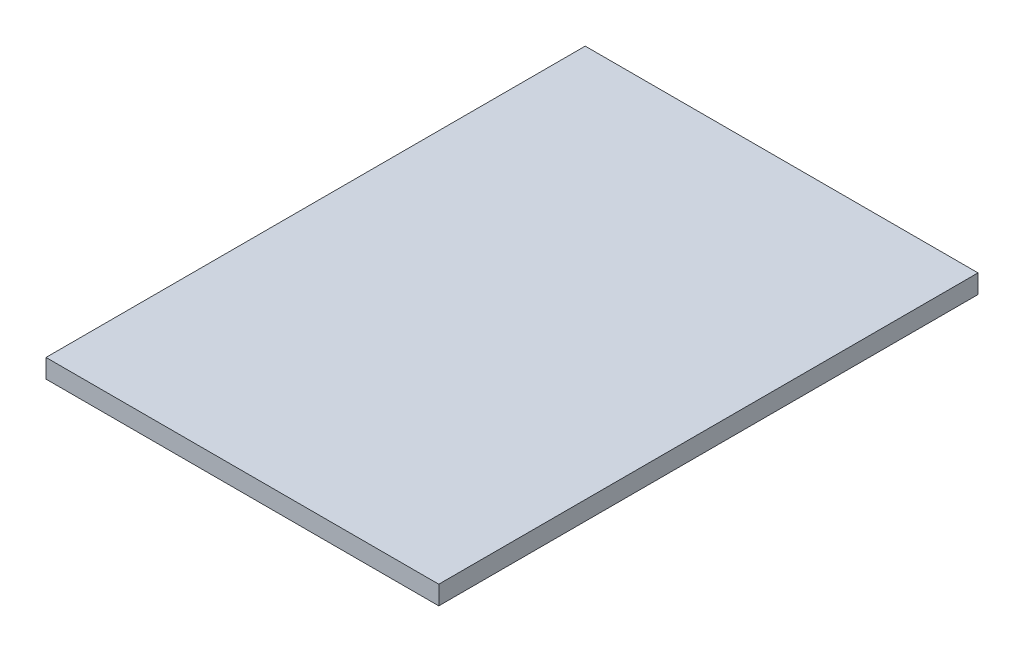
ISO-10303-21;
HEADER;
FILE_DESCRIPTION(('STEP AP214'),'2;1');
FILE_NAME('part.step','',(''),(''),'','','');
FILE_SCHEMA(('AUTOMOTIVE_DESIGN { 1 0 10303 214 1 1 1 1 }'));
ENDSEC;
DATA;
#1=APPLICATION_CONTEXT('core data for automotive mechanical design processes');
#2=APPLICATION_PROTOCOL_DEFINITION('international standard','automotive_design',2000,#1);
#3=PRODUCT_CONTEXT('',#1,'mechanical');
#4=PRODUCT('Part','Part','',(#3));
#5=PRODUCT_RELATED_PRODUCT_CATEGORY('part','',(#4));
#6=PRODUCT_DEFINITION_FORMATION('','',#4);
#7=PRODUCT_DEFINITION_CONTEXT('part definition',#1,'design');
#8=PRODUCT_DEFINITION('design','',#6,#7);
#9=PRODUCT_DEFINITION_SHAPE('','',#8);
#10=(LENGTH_UNIT() NAMED_UNIT(*) SI_UNIT(.MILLI.,.METRE.));
#11=(NAMED_UNIT(*) PLANE_ANGLE_UNIT() SI_UNIT($,.RADIAN.));
#12=(NAMED_UNIT(*) SI_UNIT($,.STERADIAN.) SOLID_ANGLE_UNIT());
#13=UNCERTAINTY_MEASURE_WITH_UNIT(LENGTH_MEASURE(1.E-05),#10,'distance_accuracy_value','');
#14=(GEOMETRIC_REPRESENTATION_CONTEXT(3) GLOBAL_UNCERTAINTY_ASSIGNED_CONTEXT((#13)) GLOBAL_UNIT_ASSIGNED_CONTEXT((#10,
#11,#12)) REPRESENTATION_CONTEXT('',''));
#15=CARTESIAN_POINT('',(0.,0.,0.));
#16=DIRECTION('',(0.,0.,1.));
#17=DIRECTION('',(1.,0.,0.));
#18=AXIS2_PLACEMENT_3D('',#15,#16,#17);
#19=CARTESIAN_POINT('',(66.3516113024572,6.35,91.0945548263358));
#20=DIRECTION('',(-1.,0.,0.));
#21=DIRECTION('',(0.,0.,1.));
#22=AXIS2_PLACEMENT_3D('',#19,#20,#21);
#23=PLANE('',#22);
#24=DIRECTION('',(0.,0.,-1.));
#25=VECTOR('',#24,1.);
#26=CARTESIAN_POINT('',(66.3516113024572,0.,91.0945548263358));
#27=LINE('',#26,#25);
#28=CARTESIAN_POINT('',(66.3516113024572,0.,91.0945548263358));
#29=VERTEX_POINT('',#28);
#30=CARTESIAN_POINT('',(66.3516113024572,0.,-91.0945548263358));
#31=VERTEX_POINT('',#30);
#32=EDGE_CURVE('E111',#29,#31,#27,.T.);
#33=ORIENTED_EDGE('',*,*,#32,.T.);
#34=DIRECTION('',(0.,-1.,0.));
#35=VECTOR('',#34,1.);
#36=CARTESIAN_POINT('',(66.3516113024572,6.35,-91.0945548263358));
#37=LINE('',#36,#35);
#38=CARTESIAN_POINT('',(66.3516113024572,6.35,-91.0945548263358));
#39=VERTEX_POINT('',#38);
#40=EDGE_CURVE('E11',#39,#31,#37,.T.);
#41=ORIENTED_EDGE('',*,*,#40,.F.);
#42=DIRECTION('',(0.,0.,-1.));
#43=VECTOR('',#42,1.);
#44=CARTESIAN_POINT('',(66.3516113024572,6.35,91.0945548263358));
#45=LINE('',#44,#43);
#46=CARTESIAN_POINT('',(66.3516113024572,6.35,91.0945548263358));
#47=VERTEX_POINT('',#46);
#48=EDGE_CURVE('E95',#47,#39,#45,.T.);
#49=ORIENTED_EDGE('',*,*,#48,.F.);
#50=DIRECTION('',(0.,-1.,0.));
#51=VECTOR('',#50,1.);
#52=CARTESIAN_POINT('',(66.3516113024572,6.35,91.0945548263358));
#53=LINE('',#52,#51);
#54=EDGE_CURVE('E107',#47,#29,#53,.T.);
#55=ORIENTED_EDGE('',*,*,#54,.T.);
#56=EDGE_LOOP('',(#33,#41,#49,#55));
#57=FACE_BOUND('',#56,.T.);
#58=ADVANCED_FACE('F43',(#57),#23,.F.);
#59=CARTESIAN_POINT('',(-66.3516113024572,6.35,-91.0945548263358));
#60=DIRECTION('',(0.,0.,1.));
#61=DIRECTION('',(1.,0.,0.));
#62=AXIS2_PLACEMENT_3D('',#59,#60,#61);
#63=PLANE('',#62);
#64=DIRECTION('',(-1.,0.,0.));
#65=VECTOR('',#64,1.);
#66=CARTESIAN_POINT('',(-66.3516113024572,0.,-91.0945548263358));
#67=LINE('',#66,#65);
#68=CARTESIAN_POINT('',(-66.3516113024572,0.,-91.0945548263358));
#69=VERTEX_POINT('',#68);
#70=EDGE_CURVE('E100',#31,#69,#67,.T.);
#71=ORIENTED_EDGE('',*,*,#70,.T.);
#72=DIRECTION('',(0.,-1.,0.));
#73=VECTOR('',#72,1.);
#74=CARTESIAN_POINT('',(-66.3516113024572,6.35,-91.0945548263358));
#75=LINE('',#74,#73);
#76=CARTESIAN_POINT('',(-66.3516113024572,6.35,-91.0945548263358));
#77=VERTEX_POINT('',#76);
#78=EDGE_CURVE('E52',#77,#69,#75,.T.);
#79=ORIENTED_EDGE('',*,*,#78,.F.);
#80=DIRECTION('',(-1.,0.,0.));
#81=VECTOR('',#80,1.);
#82=CARTESIAN_POINT('',(-66.3516113024572,6.35,-91.0945548263358));
#83=LINE('',#82,#81);
#84=EDGE_CURVE('E90',#39,#77,#83,.T.);
#85=ORIENTED_EDGE('',*,*,#84,.F.);
#86=ORIENTED_EDGE('',*,*,#40,.T.);
#87=EDGE_LOOP('',(#71,#79,#85,#86));
#88=FACE_BOUND('',#87,.T.);
#89=ADVANCED_FACE('F99',(#88),#63,.F.);
#90=CARTESIAN_POINT('',(-66.3516113024572,6.35,91.0945548263358));
#91=DIRECTION('',(1.,0.,0.));
#92=DIRECTION('',(0.,0.,-1.));
#93=AXIS2_PLACEMENT_3D('',#90,#91,#92);
#94=PLANE('',#93);
#95=DIRECTION('',(0.,0.,1.));
#96=VECTOR('',#95,1.);
#97=CARTESIAN_POINT('',(-66.3516113024572,0.,91.0945548263358));
#98=LINE('',#97,#96);
#99=CARTESIAN_POINT('',(-66.3516113024572,0.,91.0945548263358));
#100=VERTEX_POINT('',#99);
#101=EDGE_CURVE('E77',#69,#100,#98,.T.);
#102=ORIENTED_EDGE('',*,*,#101,.T.);
#103=DIRECTION('',(0.,-1.,0.));
#104=VECTOR('',#103,1.);
#105=CARTESIAN_POINT('',(-66.3516113024572,6.35,91.0945548263358));
#106=LINE('',#105,#104);
#107=CARTESIAN_POINT('',(-66.3516113024572,6.35,91.0945548263358));
#108=VERTEX_POINT('',#107);
#109=EDGE_CURVE('E102',#108,#100,#106,.T.);
#110=ORIENTED_EDGE('',*,*,#109,.F.);
#111=DIRECTION('',(0.,0.,1.));
#112=VECTOR('',#111,1.);
#113=CARTESIAN_POINT('',(-66.3516113024572,6.35,91.0945548263358));
#114=LINE('',#113,#112);
#115=EDGE_CURVE('E93',#77,#108,#114,.T.);
#116=ORIENTED_EDGE('',*,*,#115,.F.);
#117=ORIENTED_EDGE('',*,*,#78,.T.);
#118=EDGE_LOOP('',(#102,#110,#116,#117));
#119=FACE_BOUND('',#118,.T.);
#120=ADVANCED_FACE('F103',(#119),#94,.F.);
#121=CARTESIAN_POINT('',(-66.3516113024572,6.35,91.0945548263358));
#122=DIRECTION('',(0.,0.,-1.));
#123=DIRECTION('',(-1.,0.,0.));
#124=AXIS2_PLACEMENT_3D('',#121,#122,#123);
#125=PLANE('',#124);
#126=DIRECTION('',(1.,0.,0.));
#127=VECTOR('',#126,1.);
#128=CARTESIAN_POINT('',(-66.3516113024572,0.,91.0945548263358));
#129=LINE('',#128,#127);
#130=EDGE_CURVE('E83',#100,#29,#129,.T.);
#131=ORIENTED_EDGE('',*,*,#130,.T.);
#132=ORIENTED_EDGE('',*,*,#54,.F.);
#133=DIRECTION('',(1.,0.,0.));
#134=VECTOR('',#133,1.);
#135=CARTESIAN_POINT('',(-66.3516113024572,6.35,91.0945548263358));
#136=LINE('',#135,#134);
#137=EDGE_CURVE('E60',#108,#47,#136,.T.);
#138=ORIENTED_EDGE('',*,*,#137,.F.);
#139=ORIENTED_EDGE('',*,*,#109,.T.);
#140=EDGE_LOOP('',(#131,#132,#138,#139));
#141=FACE_BOUND('',#140,.T.);
#142=ADVANCED_FACE('F124',(#141),#125,.F.);
#143=CARTESIAN_POINT('',(0.,6.35,0.));
#144=DIRECTION('',(0.,-1.,0.));
#145=DIRECTION('',(0.,0.,-1.));
#146=AXIS2_PLACEMENT_3D('',#143,#144,#145);
#147=PLANE('',#146);
#148=ORIENTED_EDGE('',*,*,#48,.T.);
#149=ORIENTED_EDGE('',*,*,#84,.T.);
#150=ORIENTED_EDGE('',*,*,#115,.T.);
#151=ORIENTED_EDGE('',*,*,#137,.T.);
#152=EDGE_LOOP('',(#148,#149,#150,#151));
#153=FACE_BOUND('',#152,.T.);
#154=ADVANCED_FACE('F91',(#153),#147,.F.);
#155=CARTESIAN_POINT('',(0.,0.,0.));
#156=DIRECTION('',(0.,-1.,0.));
#157=DIRECTION('',(0.,0.,-1.));
#158=AXIS2_PLACEMENT_3D('',#155,#156,#157);
#159=PLANE('',#158);
#160=ORIENTED_EDGE('',*,*,#32,.F.);
#161=ORIENTED_EDGE('',*,*,#130,.F.);
#162=ORIENTED_EDGE('',*,*,#101,.F.);
#163=ORIENTED_EDGE('',*,*,#70,.F.);
#164=EDGE_LOOP('',(#160,#161,#162,#163));
#165=FACE_BOUND('',#164,.T.);
#166=ADVANCED_FACE('F127',(#165),#159,.T.);
#167=CLOSED_SHELL('',(#58,#89,#120,#142,#154,#166));
#168=MANIFOLD_SOLID_BREP('B2',#167);
#169=ADVANCED_BREP_SHAPE_REPRESENTATION('',(#18,#168),#14);
#170=SHAPE_DEFINITION_REPRESENTATION(#9,#169);
ENDSEC;
END-ISO-10303-21;
